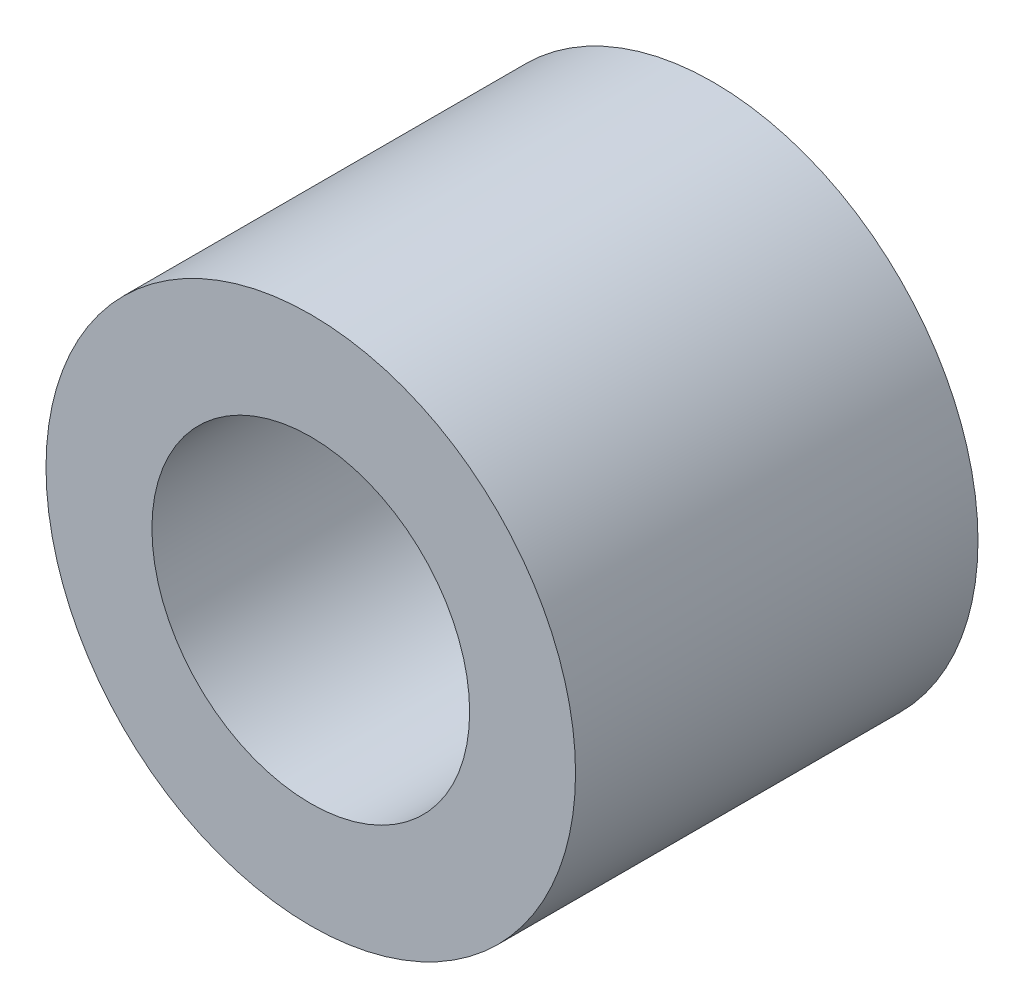
ISO-10303-21;
HEADER;
FILE_DESCRIPTION(('STEP AP214'),'2;1');
FILE_NAME('part.step','',(''),(''),'','','');
FILE_SCHEMA(('AUTOMOTIVE_DESIGN { 1 0 10303 214 1 1 1 1 }'));
ENDSEC;
DATA;
#1=APPLICATION_CONTEXT('core data for automotive mechanical design processes');
#2=APPLICATION_PROTOCOL_DEFINITION('international standard','automotive_design',2000,#1);
#3=PRODUCT_CONTEXT('',#1,'mechanical');
#4=PRODUCT('Part','Part','',(#3));
#5=PRODUCT_RELATED_PRODUCT_CATEGORY('part','',(#4));
#6=PRODUCT_DEFINITION_FORMATION('','',#4);
#7=PRODUCT_DEFINITION_CONTEXT('part definition',#1,'design');
#8=PRODUCT_DEFINITION('design','',#6,#7);
#9=PRODUCT_DEFINITION_SHAPE('','',#8);
#10=(LENGTH_UNIT() NAMED_UNIT(*) SI_UNIT(.MILLI.,.METRE.));
#11=(NAMED_UNIT(*) PLANE_ANGLE_UNIT() SI_UNIT($,.RADIAN.));
#12=(NAMED_UNIT(*) SI_UNIT($,.STERADIAN.) SOLID_ANGLE_UNIT());
#13=UNCERTAINTY_MEASURE_WITH_UNIT(LENGTH_MEASURE(1.E-05),#10,'distance_accuracy_value','');
#14=(GEOMETRIC_REPRESENTATION_CONTEXT(3) GLOBAL_UNCERTAINTY_ASSIGNED_CONTEXT((#13)) GLOBAL_UNIT_ASSIGNED_CONTEXT((#10,
#11,#12)) REPRESENTATION_CONTEXT('',''));
#15=CARTESIAN_POINT('',(0.,0.,0.));
#16=DIRECTION('',(0.,0.,1.));
#17=DIRECTION('',(1.,0.,0.));
#18=AXIS2_PLACEMENT_3D('',#15,#16,#17);
#19=CARTESIAN_POINT('',(0.,0.,3.8));
#20=DIRECTION('',(0.,0.,1.));
#21=DIRECTION('',(1.,0.,0.));
#22=AXIS2_PLACEMENT_3D('',#19,#20,#21);
#23=PLANE('',#22);
#24=CARTESIAN_POINT('',(0.,0.,3.8));
#25=DIRECTION('',(0.,0.,1.));
#26=DIRECTION('',(1.,0.,0.));
#27=AXIS2_PLACEMENT_3D('',#24,#25,#26);
#28=CIRCLE('',#27,2.5);
#29=CARTESIAN_POINT('',(-2.5,0.,3.8));
#30=VERTEX_POINT('',#29);
#31=EDGE_CURVE('E10',#30,#30,#28,.T.);
#32=ORIENTED_EDGE('',*,*,#31,.T.);
#33=EDGE_LOOP('',(#32));
#34=FACE_BOUND('',#33,.T.);
#35=CARTESIAN_POINT('',(0.,0.,3.8));
#36=DIRECTION('',(0.,0.,1.));
#37=DIRECTION('',(1.,0.,0.));
#38=AXIS2_PLACEMENT_3D('',#35,#36,#37);
#39=CIRCLE('',#38,1.5);
#40=CARTESIAN_POINT('',(-1.5,0.,3.8));
#41=VERTEX_POINT('',#40);
#42=EDGE_CURVE('E42',#41,#41,#39,.T.);
#43=ORIENTED_EDGE('',*,*,#42,.F.);
#44=EDGE_LOOP('',(#43));
#45=FACE_BOUND('',#44,.T.);
#46=ADVANCED_FACE('F31',(#34,#45),#23,.T.);
#47=CARTESIAN_POINT('',(0.,0.,0.));
#48=DIRECTION('',(0.,0.,1.));
#49=DIRECTION('',(1.,0.,0.));
#50=AXIS2_PLACEMENT_3D('',#47,#48,#49);
#51=PLANE('',#50);
#52=CARTESIAN_POINT('',(0.,0.,0.));
#53=DIRECTION('',(0.,0.,1.));
#54=DIRECTION('',(1.,0.,0.));
#55=AXIS2_PLACEMENT_3D('',#52,#53,#54);
#56=CIRCLE('',#55,2.5);
#57=CARTESIAN_POINT('',(-2.5,0.,0.));
#58=VERTEX_POINT('',#57);
#59=EDGE_CURVE('E35',#58,#58,#56,.T.);
#60=ORIENTED_EDGE('',*,*,#59,.F.);
#61=EDGE_LOOP('',(#60));
#62=FACE_BOUND('',#61,.T.);
#63=CARTESIAN_POINT('',(0.,0.,0.));
#64=DIRECTION('',(0.,0.,1.));
#65=DIRECTION('',(1.,0.,0.));
#66=AXIS2_PLACEMENT_3D('',#63,#64,#65);
#67=CIRCLE('',#66,1.5);
#68=CARTESIAN_POINT('',(-1.5,0.,0.));
#69=VERTEX_POINT('',#68);
#70=EDGE_CURVE('E44',#69,#69,#67,.T.);
#71=ORIENTED_EDGE('',*,*,#70,.T.);
#72=EDGE_LOOP('',(#71));
#73=FACE_BOUND('',#72,.T.);
#74=ADVANCED_FACE('F54',(#62,#73),#51,.F.);
#75=CARTESIAN_POINT('',(0.,0.,3.8));
#76=DIRECTION('',(0.,0.,-1.));
#77=DIRECTION('',(-1.,0.,0.));
#78=AXIS2_PLACEMENT_3D('',#75,#76,#77);
#79=CYLINDRICAL_SURFACE('',#78,2.5);
#80=CARTESIAN_POINT('',(-2.5,0.,3.8));
#81=CARTESIAN_POINT('',(-2.5,0.,3.76041666666667));
#82=CARTESIAN_POINT('',(-2.5,0.,3.72083333333333));
#83=CARTESIAN_POINT('',(-2.5,0.,3.64166666666667));
#84=CARTESIAN_POINT('',(-2.5,0.,3.60208333333333));
#85=CARTESIAN_POINT('',(-2.5,0.,3.52291666666667));
#86=CARTESIAN_POINT('',(-2.5,0.,3.48333333333333));
#87=CARTESIAN_POINT('',(-2.5,0.,3.40416666666667));
#88=CARTESIAN_POINT('',(-2.5,0.,3.36458333333333));
#89=CARTESIAN_POINT('',(-2.5,0.,3.28541666666667));
#90=CARTESIAN_POINT('',(-2.5,0.,3.24583333333333));
#91=CARTESIAN_POINT('',(-2.5,0.,3.16666666666667));
#92=CARTESIAN_POINT('',(-2.5,0.,3.12708333333333));
#93=CARTESIAN_POINT('',(-2.5,0.,3.04791666666667));
#94=CARTESIAN_POINT('',(-2.5,0.,3.00833333333333));
#95=CARTESIAN_POINT('',(-2.5,0.,2.92916666666667));
#96=CARTESIAN_POINT('',(-2.5,0.,2.88958333333333));
#97=CARTESIAN_POINT('',(-2.5,0.,2.81041666666667));
#98=CARTESIAN_POINT('',(-2.5,0.,2.77083333333333));
#99=CARTESIAN_POINT('',(-2.5,0.,2.69166666666667));
#100=CARTESIAN_POINT('',(-2.5,0.,2.65208333333333));
#101=CARTESIAN_POINT('',(-2.5,0.,2.57291666666667));
#102=CARTESIAN_POINT('',(-2.5,0.,2.53333333333333));
#103=CARTESIAN_POINT('',(-2.5,0.,2.45416666666667));
#104=CARTESIAN_POINT('',(-2.5,0.,2.41458333333333));
#105=CARTESIAN_POINT('',(-2.5,0.,2.33541666666667));
#106=CARTESIAN_POINT('',(-2.5,0.,2.29583333333333));
#107=CARTESIAN_POINT('',(-2.5,0.,2.21666666666667));
#108=CARTESIAN_POINT('',(-2.5,0.,2.17708333333333));
#109=CARTESIAN_POINT('',(-2.5,0.,2.09791666666667));
#110=CARTESIAN_POINT('',(-2.5,0.,2.05833333333333));
#111=CARTESIAN_POINT('',(-2.5,0.,1.97916666666667));
#112=CARTESIAN_POINT('',(-2.5,0.,1.93958333333333));
#113=CARTESIAN_POINT('',(-2.5,0.,1.86041666666667));
#114=CARTESIAN_POINT('',(-2.5,0.,1.82083333333333));
#115=CARTESIAN_POINT('',(-2.5,0.,1.74166666666667));
#116=CARTESIAN_POINT('',(-2.5,0.,1.70208333333333));
#117=CARTESIAN_POINT('',(-2.5,0.,1.62291666666667));
#118=CARTESIAN_POINT('',(-2.5,0.,1.58333333333333));
#119=CARTESIAN_POINT('',(-2.5,0.,1.50416666666667));
#120=CARTESIAN_POINT('',(-2.5,0.,1.46458333333333));
#121=CARTESIAN_POINT('',(-2.5,0.,1.38541666666667));
#122=CARTESIAN_POINT('',(-2.5,0.,1.34583333333333));
#123=CARTESIAN_POINT('',(-2.5,0.,1.26666666666667));
#124=CARTESIAN_POINT('',(-2.5,0.,1.22708333333333));
#125=CARTESIAN_POINT('',(-2.5,0.,1.14791666666667));
#126=CARTESIAN_POINT('',(-2.5,0.,1.10833333333333));
#127=CARTESIAN_POINT('',(-2.5,0.,1.02916666666667));
#128=CARTESIAN_POINT('',(-2.5,0.,0.989583333333334));
#129=CARTESIAN_POINT('',(-2.5,0.,0.910416666666667));
#130=CARTESIAN_POINT('',(-2.5,0.,0.870833333333333));
#131=CARTESIAN_POINT('',(-2.5,0.,0.791666666666667));
#132=CARTESIAN_POINT('',(-2.5,0.,0.752083333333333));
#133=CARTESIAN_POINT('',(-2.5,0.,0.672916666666667));
#134=CARTESIAN_POINT('',(-2.5,0.,0.633333333333333));
#135=CARTESIAN_POINT('',(-2.5,0.,0.554166666666667));
#136=CARTESIAN_POINT('',(-2.5,0.,0.514583333333334));
#137=CARTESIAN_POINT('',(-2.5,0.,0.435416666666667));
#138=CARTESIAN_POINT('',(-2.5,0.,0.395833333333334));
#139=CARTESIAN_POINT('',(-2.5,0.,0.316666666666667));
#140=CARTESIAN_POINT('',(-2.5,0.,0.277083333333333));
#141=CARTESIAN_POINT('',(-2.5,0.,0.197916666666667));
#142=CARTESIAN_POINT('',(-2.5,0.,0.158333333333333));
#143=CARTESIAN_POINT('',(-2.5,0.,0.0791666666666666));
#144=CARTESIAN_POINT('',(-2.5,0.,0.0395833333333333));
#145=CARTESIAN_POINT('',(-2.5,0.,0.));
#146=B_SPLINE_CURVE_WITH_KNOTS('',3,(#80,#81,#82,#83,#84,#85,#86,#87,#88,#89,#90,#91,#92,#93,
#94,#95,#96,#97,#98,#99,#100,#101,#102,#103,#104,#105,#106,#107,#108,#109,#110,#111,#112,#113,
#114,#115,#116,#117,#118,#119,#120,#121,#122,#123,#124,#125,#126,#127,#128,#129,#130,#131,#132,
#133,#134,#135,#136,#137,#138,#139,#140,#141,#142,#143,#144,#145),.UNSPECIFIED.,.F.,.F.,(4,2,2,
2,2,2,2,2,2,2,2,2,2,2,2,2,2,2,2,2,2,2,2,2,2,2,2,2,2,2,2,2,4),(0.,0.11875,0.2375,0.35625,0.475,
0.59375,0.7125,0.83125,0.95,1.06875,1.1875,1.30625,1.425,1.54375,1.6625,1.78125,1.9,2.01875,
2.1375,2.25625,2.375,2.49375,2.6125,2.73125,2.85,2.96875,3.0875,3.20625,3.325,3.44375,3.5625,
3.68125,3.8),.UNSPECIFIED.);
#147=EDGE_CURVE('BSEAM33',#30,#58,#146,.T.);
#148=ORIENTED_EDGE('',*,*,#31,.F.);
#149=ORIENTED_EDGE('',*,*,#59,.T.);
#150=ORIENTED_EDGE('',*,*,#147,.T.);
#151=ORIENTED_EDGE('',*,*,#147,.F.);
#152=EDGE_LOOP('',(#148,#150,#149,#151));
#153=FACE_BOUND('',#152,.T.);
#154=ADVANCED_FACE('F33',(#153),#79,.T.);
#155=CARTESIAN_POINT('',(0.,0.,3.8));
#156=DIRECTION('',(0.,0.,-1.));
#157=DIRECTION('',(-1.,0.,0.));
#158=AXIS2_PLACEMENT_3D('',#155,#156,#157);
#159=CYLINDRICAL_SURFACE('',#158,1.5);
#160=CARTESIAN_POINT('',(-1.5,0.,3.8));
#161=CARTESIAN_POINT('',(-1.5,0.,3.76041666666667));
#162=CARTESIAN_POINT('',(-1.5,0.,3.72083333333333));
#163=CARTESIAN_POINT('',(-1.5,0.,3.64166666666667));
#164=CARTESIAN_POINT('',(-1.5,0.,3.60208333333333));
#165=CARTESIAN_POINT('',(-1.5,0.,3.52291666666667));
#166=CARTESIAN_POINT('',(-1.5,0.,3.48333333333333));
#167=CARTESIAN_POINT('',(-1.5,0.,3.40416666666667));
#168=CARTESIAN_POINT('',(-1.5,0.,3.36458333333333));
#169=CARTESIAN_POINT('',(-1.5,0.,3.28541666666667));
#170=CARTESIAN_POINT('',(-1.5,0.,3.24583333333333));
#171=CARTESIAN_POINT('',(-1.5,0.,3.16666666666667));
#172=CARTESIAN_POINT('',(-1.5,0.,3.12708333333333));
#173=CARTESIAN_POINT('',(-1.5,0.,3.04791666666667));
#174=CARTESIAN_POINT('',(-1.5,0.,3.00833333333333));
#175=CARTESIAN_POINT('',(-1.5,0.,2.92916666666667));
#176=CARTESIAN_POINT('',(-1.5,0.,2.88958333333333));
#177=CARTESIAN_POINT('',(-1.5,0.,2.81041666666667));
#178=CARTESIAN_POINT('',(-1.5,0.,2.77083333333333));
#179=CARTESIAN_POINT('',(-1.5,0.,2.69166666666667));
#180=CARTESIAN_POINT('',(-1.5,0.,2.65208333333333));
#181=CARTESIAN_POINT('',(-1.5,0.,2.57291666666667));
#182=CARTESIAN_POINT('',(-1.5,0.,2.53333333333333));
#183=CARTESIAN_POINT('',(-1.5,0.,2.45416666666667));
#184=CARTESIAN_POINT('',(-1.5,0.,2.41458333333333));
#185=CARTESIAN_POINT('',(-1.5,0.,2.33541666666667));
#186=CARTESIAN_POINT('',(-1.5,0.,2.29583333333333));
#187=CARTESIAN_POINT('',(-1.5,0.,2.21666666666667));
#188=CARTESIAN_POINT('',(-1.5,0.,2.17708333333333));
#189=CARTESIAN_POINT('',(-1.5,0.,2.09791666666667));
#190=CARTESIAN_POINT('',(-1.5,0.,2.05833333333333));
#191=CARTESIAN_POINT('',(-1.5,0.,1.97916666666667));
#192=CARTESIAN_POINT('',(-1.5,0.,1.93958333333333));
#193=CARTESIAN_POINT('',(-1.5,0.,1.86041666666667));
#194=CARTESIAN_POINT('',(-1.5,0.,1.82083333333333));
#195=CARTESIAN_POINT('',(-1.5,0.,1.74166666666667));
#196=CARTESIAN_POINT('',(-1.5,0.,1.70208333333333));
#197=CARTESIAN_POINT('',(-1.5,0.,1.62291666666667));
#198=CARTESIAN_POINT('',(-1.5,0.,1.58333333333333));
#199=CARTESIAN_POINT('',(-1.5,0.,1.50416666666667));
#200=CARTESIAN_POINT('',(-1.5,0.,1.46458333333333));
#201=CARTESIAN_POINT('',(-1.5,0.,1.38541666666667));
#202=CARTESIAN_POINT('',(-1.5,0.,1.34583333333333));
#203=CARTESIAN_POINT('',(-1.5,0.,1.26666666666667));
#204=CARTESIAN_POINT('',(-1.5,0.,1.22708333333333));
#205=CARTESIAN_POINT('',(-1.5,0.,1.14791666666667));
#206=CARTESIAN_POINT('',(-1.5,0.,1.10833333333333));
#207=CARTESIAN_POINT('',(-1.5,0.,1.02916666666667));
#208=CARTESIAN_POINT('',(-1.5,0.,0.989583333333333));
#209=CARTESIAN_POINT('',(-1.5,0.,0.910416666666667));
#210=CARTESIAN_POINT('',(-1.5,0.,0.870833333333333));
#211=CARTESIAN_POINT('',(-1.5,0.,0.791666666666667));
#212=CARTESIAN_POINT('',(-1.5,0.,0.752083333333333));
#213=CARTESIAN_POINT('',(-1.5,0.,0.672916666666667));
#214=CARTESIAN_POINT('',(-1.5,0.,0.633333333333333));
#215=CARTESIAN_POINT('',(-1.5,0.,0.554166666666667));
#216=CARTESIAN_POINT('',(-1.5,0.,0.514583333333334));
#217=CARTESIAN_POINT('',(-1.5,0.,0.435416666666667));
#218=CARTESIAN_POINT('',(-1.5,0.,0.395833333333333));
#219=CARTESIAN_POINT('',(-1.5,0.,0.316666666666666));
#220=CARTESIAN_POINT('',(-1.5,0.,0.277083333333333));
#221=CARTESIAN_POINT('',(-1.5,0.,0.197916666666667));
#222=CARTESIAN_POINT('',(-1.5,0.,0.158333333333333));
#223=CARTESIAN_POINT('',(-1.5,0.,0.0791666666666666));
#224=CARTESIAN_POINT('',(-1.5,0.,0.0395833333333333));
#225=CARTESIAN_POINT('',(-1.5,0.,0.));
#226=B_SPLINE_CURVE_WITH_KNOTS('',3,(#160,#161,#162,#163,#164,#165,#166,#167,#168,#169,#170,
#171,#172,#173,#174,#175,#176,#177,#178,#179,#180,#181,#182,#183,#184,#185,#186,#187,#188,#189,
#190,#191,#192,#193,#194,#195,#196,#197,#198,#199,#200,#201,#202,#203,#204,#205,#206,#207,#208,
#209,#210,#211,#212,#213,#214,#215,#216,#217,#218,#219,#220,#221,#222,#223,#224,#225),
.UNSPECIFIED.,.F.,.F.,(4,2,2,2,2,2,2,2,2,2,2,2,2,2,2,2,2,2,2,2,2,2,2,2,2,2,2,2,2,2,2,2,4),(0.,
0.11875,0.2375,0.35625,0.475,0.59375,0.7125,0.831249999999999,0.95,1.06875,1.1875,1.30625,1.425,
1.54375,1.6625,1.78125,1.9,2.01875,2.1375,2.25625,2.375,2.49375,2.6125,2.73125,2.85,2.96875,
3.0875,3.20625,3.325,3.44375,3.5625,3.68125,3.8),.UNSPECIFIED.);
#227=EDGE_CURVE('BSEAM50',#41,#69,#226,.T.);
#228=ORIENTED_EDGE('',*,*,#42,.T.);
#229=ORIENTED_EDGE('',*,*,#70,.F.);
#230=ORIENTED_EDGE('',*,*,#227,.T.);
#231=ORIENTED_EDGE('',*,*,#227,.F.);
#232=EDGE_LOOP('',(#228,#230,#229,#231));
#233=FACE_BOUND('',#232,.T.);
#234=ADVANCED_FACE('F50',(#233),#159,.F.);
#235=CLOSED_SHELL('',(#46,#74,#154,#234));
#236=MANIFOLD_SOLID_BREP('B2',#235);
#237=ADVANCED_BREP_SHAPE_REPRESENTATION('',(#18,#236),#14);
#238=SHAPE_DEFINITION_REPRESENTATION(#9,#237);
ENDSEC;
END-ISO-10303-21;
